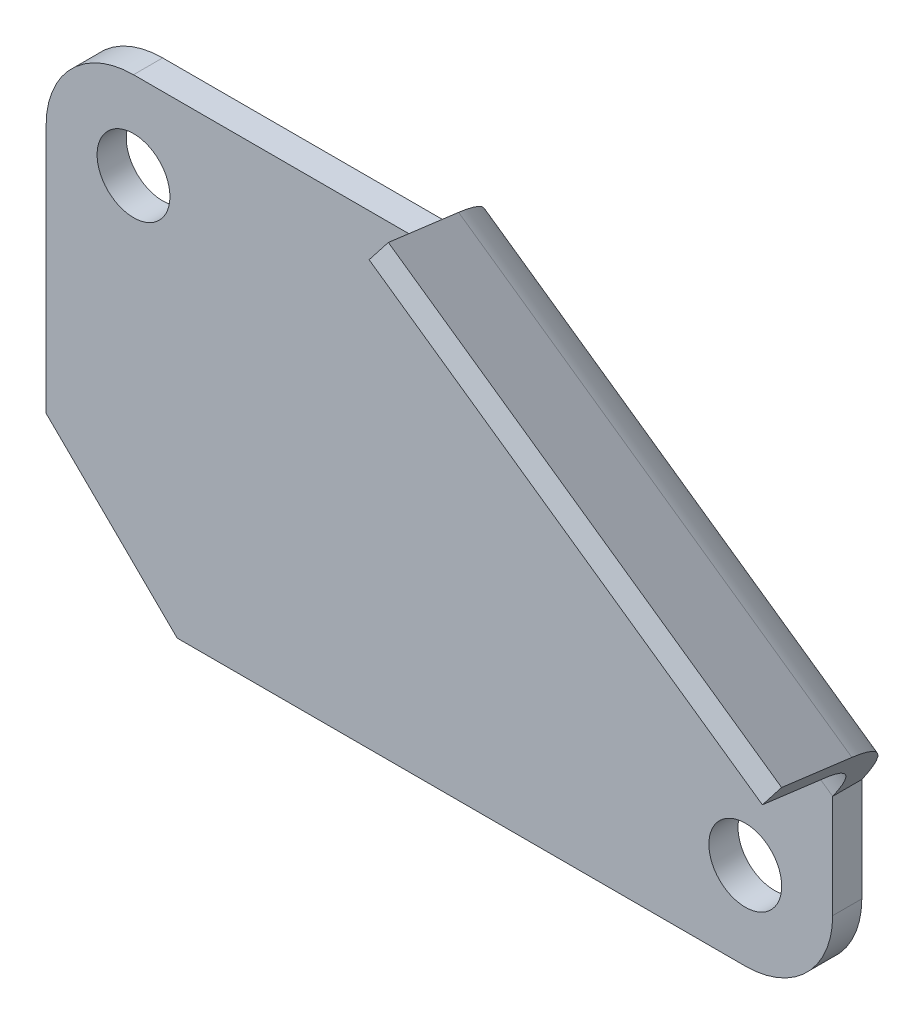
ISO-10303-21;
HEADER;
FILE_DESCRIPTION(('STEP AP214'),'2;1');
FILE_NAME('part.step','',(''),(''),'','','');
FILE_SCHEMA(('AUTOMOTIVE_DESIGN { 1 0 10303 214 1 1 1 1 }'));
ENDSEC;
DATA;
#1=APPLICATION_CONTEXT('core data for automotive mechanical design processes');
#2=APPLICATION_PROTOCOL_DEFINITION('international standard','automotive_design',2000,#1);
#3=PRODUCT_CONTEXT('',#1,'mechanical');
#4=PRODUCT('Part','Part','',(#3));
#5=PRODUCT_RELATED_PRODUCT_CATEGORY('part','',(#4));
#6=PRODUCT_DEFINITION_FORMATION('','',#4);
#7=PRODUCT_DEFINITION_CONTEXT('part definition',#1,'design');
#8=PRODUCT_DEFINITION('design','',#6,#7);
#9=PRODUCT_DEFINITION_SHAPE('','',#8);
#10=(LENGTH_UNIT() NAMED_UNIT(*) SI_UNIT(.MILLI.,.METRE.));
#11=(NAMED_UNIT(*) PLANE_ANGLE_UNIT() SI_UNIT($,.RADIAN.));
#12=(NAMED_UNIT(*) SI_UNIT($,.STERADIAN.) SOLID_ANGLE_UNIT());
#13=UNCERTAINTY_MEASURE_WITH_UNIT(LENGTH_MEASURE(1.E-05),#10,'distance_accuracy_value','');
#14=(GEOMETRIC_REPRESENTATION_CONTEXT(3) GLOBAL_UNCERTAINTY_ASSIGNED_CONTEXT((#13)) GLOBAL_UNIT_ASSIGNED_CONTEXT((#10,
#11,#12)) REPRESENTATION_CONTEXT('',''));
#15=CARTESIAN_POINT('',(0.,0.,0.));
#16=DIRECTION('',(0.,0.,1.));
#17=DIRECTION('',(1.,0.,0.));
#18=AXIS2_PLACEMENT_3D('',#15,#16,#17);
#19=CARTESIAN_POINT('',(95793.2786304845,11786.1362503613,4000.));
#20=DIRECTION('',(0.,0.,-1.));
#21=DIRECTION('',(-1.,0.,0.));
#22=AXIS2_PLACEMENT_3D('',#19,#20,#21);
#23=PLANE('',#22);
#24=CARTESIAN_POINT('',(95793.2786304845,11786.1362503613,4000.));
#25=DIRECTION('',(0.,0.,1.));
#26=DIRECTION('',(-1.,0.,0.));
#27=AXIS2_PLACEMENT_3D('',#24,#25,#26);
#28=CIRCLE('',#27,12000.);
#29=CARTESIAN_POINT('',(95793.2786304844,-213.863749638706,4000.));
#30=VERTEX_POINT('',#29);
#31=CARTESIAN_POINT('',(107793.278630484,11786.1362503614,4000.));
#32=VERTEX_POINT('',#31);
#33=EDGE_CURVE('E154',#30,#32,#28,.T.);
#34=ORIENTED_EDGE('',*,*,#33,.T.);
#35=DIRECTION('',(0.,1.,0.));
#36=VECTOR('',#35,1.);
#37=CARTESIAN_POINT('',(107793.278630484,25974.9291870368,4000.));
#38=LINE('',#37,#36);
#39=CARTESIAN_POINT('',(107793.278630484,25974.9291870368,4000.));
#40=VERTEX_POINT('',#39);
#41=EDGE_CURVE('E100',#32,#40,#38,.T.);
#42=ORIENTED_EDGE('',*,*,#41,.T.);
#43=DIRECTION('',(-0.819152044288991,0.573576436351048,0.));
#44=VECTOR('',#43,1.);
#45=CARTESIAN_POINT('',(53793.2786304845,63786.1362503613,4000.));
#46=LINE('',#45,#44);
#47=CARTESIAN_POINT('',(53793.2786304845,63786.1362503613,4000.));
#48=VERTEX_POINT('',#47);
#49=EDGE_CURVE('E181',#40,#48,#46,.T.);
#50=ORIENTED_EDGE('',*,*,#49,.T.);
#51=DIRECTION('',(-1.,0.,0.));
#52=VECTOR('',#51,1.);
#53=CARTESIAN_POINT('',(11793.2786304846,63786.1362503613,4000.));
#54=LINE('',#53,#52);
#55=CARTESIAN_POINT('',(11793.2786304846,63786.1362503613,4000.));
#56=VERTEX_POINT('',#55);
#57=EDGE_CURVE('E190',#48,#56,#54,.T.);
#58=ORIENTED_EDGE('',*,*,#57,.T.);
#59=CARTESIAN_POINT('',(11793.2786304845,51786.1362503613,4000.));
#60=DIRECTION('',(0.,0.,1.));
#61=DIRECTION('',(1.,0.,0.));
#62=AXIS2_PLACEMENT_3D('',#59,#60,#61);
#63=CIRCLE('',#62,12000.);
#64=CARTESIAN_POINT('',(-206.721369515522,51786.1362503612,4000.));
#65=VERTEX_POINT('',#64);
#66=EDGE_CURVE('E119',#56,#65,#63,.T.);
#67=ORIENTED_EDGE('',*,*,#66,.T.);
#68=DIRECTION('',(0.,-1.,0.));
#69=VECTOR('',#68,1.);
#70=CARTESIAN_POINT('',(-206.72136951552,17513.785772275,4000.));
#71=LINE('',#70,#69);
#72=CARTESIAN_POINT('',(-206.72136951552,17513.785772275,4000.));
#73=VERTEX_POINT('',#72);
#74=EDGE_CURVE('E111',#65,#73,#71,.T.);
#75=ORIENTED_EDGE('',*,*,#74,.T.);
#76=DIRECTION('',(0.712476328052723,-0.701696146465483,0.));
#77=VECTOR('',#76,1.);
#78=CARTESIAN_POINT('',(-206.72136951552,17513.785772275,4000.));
#79=LINE('',#78,#77);
#80=CARTESIAN_POINT('',(17793.2786304845,-213.863749638716,4000.));
#81=VERTEX_POINT('',#80);
#82=EDGE_CURVE('E120',#73,#81,#79,.T.);
#83=ORIENTED_EDGE('',*,*,#82,.T.);
#84=DIRECTION('',(1.,0.,0.));
#85=VECTOR('',#84,1.);
#86=CARTESIAN_POINT('',(95793.2786304844,-213.863749638706,4000.));
#87=LINE('',#86,#85);
#88=EDGE_CURVE('E57',#81,#30,#87,.T.);
#89=ORIENTED_EDGE('',*,*,#88,.T.);
#90=EDGE_LOOP('',(#34,#42,#50,#58,#67,#75,#83,#89));
#91=FACE_BOUND('',#90,.T.);
#92=CARTESIAN_POINT('',(11793.2786304845,51786.1362503613,4000.));
#93=DIRECTION('',(0.,0.,1.));
#94=DIRECTION('',(1.,0.,0.));
#95=AXIS2_PLACEMENT_3D('',#92,#93,#94);
#96=CIRCLE('',#95,5000.);
#97=CARTESIAN_POINT('',(16793.2786304845,51786.1362503613,4000.));
#98=VERTEX_POINT('',#97);
#99=EDGE_CURVE('E141',#98,#98,#96,.T.);
#100=ORIENTED_EDGE('',*,*,#99,.F.);
#101=EDGE_LOOP('',(#100));
#102=FACE_BOUND('',#101,.T.);
#103=CARTESIAN_POINT('',(95793.2786304845,11786.1362503613,4000.));
#104=DIRECTION('',(0.,0.,1.));
#105=DIRECTION('',(1.,0.,0.));
#106=AXIS2_PLACEMENT_3D('',#103,#104,#105);
#107=CIRCLE('',#106,5000.);
#108=CARTESIAN_POINT('',(100793.278630484,11786.1362503613,4000.));
#109=VERTEX_POINT('',#108);
#110=EDGE_CURVE('E197',#109,#109,#107,.T.);
#111=ORIENTED_EDGE('',*,*,#110,.F.);
#112=EDGE_LOOP('',(#111));
#113=FACE_BOUND('',#112,.T.);
#114=ADVANCED_FACE('F39',(#91,#102,#113),#23,.F.);
#115=CARTESIAN_POINT('',(95793.2786304845,11786.1362503613,0.));
#116=DIRECTION('',(0.,0.,-1.));
#117=DIRECTION('',(-1.,0.,0.));
#118=AXIS2_PLACEMENT_3D('',#115,#116,#117);
#119=PLANE('',#118);
#120=CARTESIAN_POINT('',(11793.2786304845,51786.1362503613,0.));
#121=DIRECTION('',(0.,0.,1.));
#122=DIRECTION('',(1.,0.,0.));
#123=AXIS2_PLACEMENT_3D('',#120,#121,#122);
#124=CIRCLE('',#123,5000.);
#125=CARTESIAN_POINT('',(16793.2786304845,51786.1362503613,0.));
#126=VERTEX_POINT('',#125);
#127=EDGE_CURVE('E194',#126,#126,#124,.T.);
#128=ORIENTED_EDGE('',*,*,#127,.T.);
#129=EDGE_LOOP('',(#128));
#130=FACE_BOUND('',#129,.T.);
#131=CARTESIAN_POINT('',(95793.2786304845,11786.1362503613,0.));
#132=DIRECTION('',(0.,0.,1.));
#133=DIRECTION('',(-1.,0.,0.));
#134=AXIS2_PLACEMENT_3D('',#131,#132,#133);
#135=CIRCLE('',#134,12000.);
#136=CARTESIAN_POINT('',(95793.2786304844,-213.863749638706,0.));
#137=VERTEX_POINT('',#136);
#138=CARTESIAN_POINT('',(107793.278630484,11786.1362503614,0.));
#139=VERTEX_POINT('',#138);
#140=EDGE_CURVE('E140',#137,#139,#135,.T.);
#141=ORIENTED_EDGE('',*,*,#140,.F.);
#142=DIRECTION('',(1.,0.,0.));
#143=VECTOR('',#142,1.);
#144=CARTESIAN_POINT('',(95793.2786304844,-213.863749638706,0.));
#145=LINE('',#144,#143);
#146=CARTESIAN_POINT('',(17793.2786304845,-213.863749638716,0.));
#147=VERTEX_POINT('',#146);
#148=EDGE_CURVE('E87',#147,#137,#145,.T.);
#149=ORIENTED_EDGE('',*,*,#148,.F.);
#150=DIRECTION('',(0.712476328052723,-0.701696146465483,0.));
#151=VECTOR('',#150,1.);
#152=CARTESIAN_POINT('',(-206.72136951552,17513.785772275,0.));
#153=LINE('',#152,#151);
#154=CARTESIAN_POINT('',(-206.72136951552,17513.785772275,0.));
#155=VERTEX_POINT('',#154);
#156=EDGE_CURVE('E81',#155,#147,#153,.T.);
#157=ORIENTED_EDGE('',*,*,#156,.F.);
#158=DIRECTION('',(0.,-1.,0.));
#159=VECTOR('',#158,1.);
#160=CARTESIAN_POINT('',(-206.72136951552,17513.785772275,0.));
#161=LINE('',#160,#159);
#162=CARTESIAN_POINT('',(-206.721369515522,51786.1362503612,0.));
#163=VERTEX_POINT('',#162);
#164=EDGE_CURVE('E130',#163,#155,#161,.T.);
#165=ORIENTED_EDGE('',*,*,#164,.F.);
#166=CARTESIAN_POINT('',(11793.2786304845,51786.1362503613,0.));
#167=DIRECTION('',(0.,0.,1.));
#168=DIRECTION('',(1.,0.,0.));
#169=AXIS2_PLACEMENT_3D('',#166,#167,#168);
#170=CIRCLE('',#169,12000.);
#171=CARTESIAN_POINT('',(11793.2786304846,63786.1362503613,0.));
#172=VERTEX_POINT('',#171);
#173=EDGE_CURVE('E146',#172,#163,#170,.T.);
#174=ORIENTED_EDGE('',*,*,#173,.F.);
#175=DIRECTION('',(-1.,0.,0.));
#176=VECTOR('',#175,1.);
#177=CARTESIAN_POINT('',(11793.2786304846,63786.1362503613,0.));
#178=LINE('',#177,#176);
#179=CARTESIAN_POINT('',(53793.2786304845,63786.1362503613,0.));
#180=VERTEX_POINT('',#179);
#181=EDGE_CURVE('E150',#180,#172,#178,.T.);
#182=ORIENTED_EDGE('',*,*,#181,.F.);
#183=DIRECTION('',(-0.819152044288991,0.573576436351048,0.));
#184=VECTOR('',#183,1.);
#185=CARTESIAN_POINT('',(53793.2786304845,63786.1362503613,0.));
#186=LINE('',#185,#184);
#187=CARTESIAN_POINT('',(107793.278630485,25974.9291870368,0.));
#188=VERTEX_POINT('',#187);
#189=EDGE_CURVE('E143',#188,#180,#186,.T.);
#190=ORIENTED_EDGE('',*,*,#189,.F.);
#191=DIRECTION('',(0.,1.,0.));
#192=VECTOR('',#191,1.);
#193=CARTESIAN_POINT('',(107793.278630484,25974.9291870368,0.));
#194=LINE('',#193,#192);
#195=EDGE_CURVE('E139',#139,#188,#194,.T.);
#196=ORIENTED_EDGE('',*,*,#195,.F.);
#197=EDGE_LOOP('',(#141,#149,#157,#165,#174,#182,#190,#196));
#198=FACE_BOUND('',#197,.T.);
#199=CARTESIAN_POINT('',(95793.2786304845,11786.1362503613,0.));
#200=DIRECTION('',(0.,0.,1.));
#201=DIRECTION('',(1.,0.,0.));
#202=AXIS2_PLACEMENT_3D('',#199,#200,#201);
#203=CIRCLE('',#202,5000.);
#204=CARTESIAN_POINT('',(100793.278630484,11786.1362503613,0.));
#205=VERTEX_POINT('',#204);
#206=EDGE_CURVE('E199',#205,#205,#203,.T.);
#207=ORIENTED_EDGE('',*,*,#206,.T.);
#208=EDGE_LOOP('',(#207));
#209=FACE_BOUND('',#208,.T.);
#210=ADVANCED_FACE('F277',(#130,#198,#209),#119,.T.);
#211=CARTESIAN_POINT('',(95793.2786304845,11786.1362503613,4000.));
#212=DIRECTION('',(0.,0.,-1.));
#213=DIRECTION('',(-1.,0.,0.));
#214=AXIS2_PLACEMENT_3D('',#211,#212,#213);
#215=CYLINDRICAL_SURFACE('',#214,12000.);
#216=ORIENTED_EDGE('',*,*,#140,.T.);
#217=DIRECTION('',(0.,0.,-1.));
#218=VECTOR('',#217,1.);
#219=CARTESIAN_POINT('',(107793.278630484,11786.1362503614,4000.));
#220=LINE('',#219,#218);
#221=EDGE_CURVE('E11',#32,#139,#220,.T.);
#222=ORIENTED_EDGE('',*,*,#221,.F.);
#223=ORIENTED_EDGE('',*,*,#33,.F.);
#224=DIRECTION('',(0.,0.,-1.));
#225=VECTOR('',#224,1.);
#226=CARTESIAN_POINT('',(95793.2786304844,-213.863749638706,4000.));
#227=LINE('',#226,#225);
#228=EDGE_CURVE('E133',#30,#137,#227,.T.);
#229=ORIENTED_EDGE('',*,*,#228,.T.);
#230=EDGE_LOOP('',(#216,#222,#223,#229));
#231=FACE_BOUND('',#230,.T.);
#232=ADVANCED_FACE('F41',(#231),#215,.T.);
#233=CARTESIAN_POINT('',(107793.278630484,25974.9291870368,4000.));
#234=DIRECTION('',(-1.,0.,0.));
#235=DIRECTION('',(0.,0.,1.));
#236=AXIS2_PLACEMENT_3D('',#233,#234,#235);
#237=PLANE('',#236);
#238=ORIENTED_EDGE('',*,*,#195,.T.);
#239=DIRECTION('',(0.,0.,-1.));
#240=VECTOR('',#239,1.);
#241=CARTESIAN_POINT('',(107793.278630484,25974.9291870368,4000.));
#242=LINE('',#241,#240);
#243=EDGE_CURVE('E48',#40,#188,#242,.T.);
#244=ORIENTED_EDGE('',*,*,#243,.F.);
#245=ORIENTED_EDGE('',*,*,#41,.F.);
#246=ORIENTED_EDGE('',*,*,#221,.T.);
#247=EDGE_LOOP('',(#238,#244,#245,#246));
#248=FACE_BOUND('',#247,.T.);
#249=ADVANCED_FACE('F178',(#248),#237,.F.);
#250=CARTESIAN_POINT('',(11793.2786304846,63786.1362503613,4000.));
#251=DIRECTION('',(0.,-1.,0.));
#252=DIRECTION('',(0.,0.,-1.));
#253=AXIS2_PLACEMENT_3D('',#250,#251,#252);
#254=PLANE('',#253);
#255=ORIENTED_EDGE('',*,*,#181,.T.);
#256=DIRECTION('',(0.,0.,-1.));
#257=VECTOR('',#256,1.);
#258=CARTESIAN_POINT('',(11793.2786304846,63786.1362503613,4000.));
#259=LINE('',#258,#257);
#260=EDGE_CURVE('E156',#56,#172,#259,.T.);
#261=ORIENTED_EDGE('',*,*,#260,.F.);
#262=ORIENTED_EDGE('',*,*,#57,.F.);
#263=DIRECTION('',(0.,0.,-1.));
#264=VECTOR('',#263,1.);
#265=CARTESIAN_POINT('',(53793.2786304845,63786.1362503613,4000.));
#266=LINE('',#265,#264);
#267=EDGE_CURVE('E162',#48,#180,#266,.T.);
#268=ORIENTED_EDGE('',*,*,#267,.T.);
#269=EDGE_LOOP('',(#255,#261,#262,#268));
#270=FACE_BOUND('',#269,.T.);
#271=ADVANCED_FACE('F296',(#270),#254,.F.);
#272=CARTESIAN_POINT('',(11793.2786304845,51786.1362503613,4000.));
#273=DIRECTION('',(0.,0.,-1.));
#274=DIRECTION('',(-1.,0.,0.));
#275=AXIS2_PLACEMENT_3D('',#272,#273,#274);
#276=CYLINDRICAL_SURFACE('',#275,12000.);
#277=ORIENTED_EDGE('',*,*,#173,.T.);
#278=DIRECTION('',(0.,0.,-1.));
#279=VECTOR('',#278,1.);
#280=CARTESIAN_POINT('',(-206.721369515522,51786.1362503612,4000.));
#281=LINE('',#280,#279);
#282=EDGE_CURVE('E126',#65,#163,#281,.T.);
#283=ORIENTED_EDGE('',*,*,#282,.F.);
#284=ORIENTED_EDGE('',*,*,#66,.F.);
#285=ORIENTED_EDGE('',*,*,#260,.T.);
#286=EDGE_LOOP('',(#277,#283,#284,#285));
#287=FACE_BOUND('',#286,.T.);
#288=ADVANCED_FACE('F300',(#287),#276,.T.);
#289=CARTESIAN_POINT('',(-206.72136951552,17513.785772275,4000.));
#290=DIRECTION('',(1.,0.,0.));
#291=DIRECTION('',(0.,0.,-1.));
#292=AXIS2_PLACEMENT_3D('',#289,#290,#291);
#293=PLANE('',#292);
#294=ORIENTED_EDGE('',*,*,#164,.T.);
#295=DIRECTION('',(0.,0.,-1.));
#296=VECTOR('',#295,1.);
#297=CARTESIAN_POINT('',(-206.72136951552,17513.785772275,4000.));
#298=LINE('',#297,#296);
#299=EDGE_CURVE('E125',#73,#155,#298,.T.);
#300=ORIENTED_EDGE('',*,*,#299,.F.);
#301=ORIENTED_EDGE('',*,*,#74,.F.);
#302=ORIENTED_EDGE('',*,*,#282,.T.);
#303=EDGE_LOOP('',(#294,#300,#301,#302));
#304=FACE_BOUND('',#303,.T.);
#305=ADVANCED_FACE('F124',(#304),#293,.F.);
#306=CARTESIAN_POINT('',(-206.72136951552,17513.785772275,4000.));
#307=DIRECTION('',(0.701696146465483,0.712476328052723,0.));
#308=DIRECTION('',(-0.712476328052723,0.701696146465483,0.));
#309=AXIS2_PLACEMENT_3D('',#306,#307,#308);
#310=PLANE('',#309);
#311=ORIENTED_EDGE('',*,*,#156,.T.);
#312=DIRECTION('',(0.,0.,-1.));
#313=VECTOR('',#312,1.);
#314=CARTESIAN_POINT('',(17793.2786304845,-213.863749638716,4000.));
#315=LINE('',#314,#313);
#316=EDGE_CURVE('E129',#81,#147,#315,.T.);
#317=ORIENTED_EDGE('',*,*,#316,.F.);
#318=ORIENTED_EDGE('',*,*,#82,.F.);
#319=ORIENTED_EDGE('',*,*,#299,.T.);
#320=EDGE_LOOP('',(#311,#317,#318,#319));
#321=FACE_BOUND('',#320,.T.);
#322=ADVANCED_FACE('F131',(#321),#310,.F.);
#323=CARTESIAN_POINT('',(95793.2786304844,-213.863749638706,4000.));
#324=DIRECTION('',(0.,1.,0.));
#325=DIRECTION('',(-1.,0.,0.));
#326=AXIS2_PLACEMENT_3D('',#323,#324,#325);
#327=PLANE('',#326);
#328=ORIENTED_EDGE('',*,*,#148,.T.);
#329=ORIENTED_EDGE('',*,*,#228,.F.);
#330=ORIENTED_EDGE('',*,*,#88,.F.);
#331=ORIENTED_EDGE('',*,*,#316,.T.);
#332=EDGE_LOOP('',(#328,#329,#330,#331));
#333=FACE_BOUND('',#332,.T.);
#334=ADVANCED_FACE('F286',(#333),#327,.F.);
#335=CARTESIAN_POINT('',(11793.2786304845,51786.1362503613,4000.));
#336=DIRECTION('',(0.,0.,-1.));
#337=DIRECTION('',(-1.,0.,0.));
#338=AXIS2_PLACEMENT_3D('',#335,#336,#337);
#339=CYLINDRICAL_SURFACE('',#338,5000.);
#340=ORIENTED_EDGE('',*,*,#99,.T.);
#341=EDGE_LOOP('',(#340));
#342=FACE_BOUND('',#341,.T.);
#343=ORIENTED_EDGE('',*,*,#127,.F.);
#344=EDGE_LOOP('',(#343));
#345=FACE_BOUND('',#344,.T.);
#346=ADVANCED_FACE('F290',(#342,#345),#339,.F.);
#347=CARTESIAN_POINT('',(95793.2786304845,11786.1362503613,4000.));
#348=DIRECTION('',(0.,0.,-1.));
#349=DIRECTION('',(-1.,0.,0.));
#350=AXIS2_PLACEMENT_3D('',#347,#348,#349);
#351=CYLINDRICAL_SURFACE('',#350,5000.);
#352=ORIENTED_EDGE('',*,*,#110,.T.);
#353=EDGE_LOOP('',(#352));
#354=FACE_BOUND('',#353,.T.);
#355=ORIENTED_EDGE('',*,*,#206,.F.);
#356=EDGE_LOOP('',(#355));
#357=FACE_BOUND('',#356,.T.);
#358=ADVANCED_FACE('F321',(#354,#357),#351,.F.);
#359=CARTESIAN_POINT('',(53793.2786304845,63786.1362503613,16000.));
#360=DIRECTION('',(0.819152044288991,-0.573576436351048,0.));
#361=DIRECTION('',(0.573576436351048,0.81915204428899,0.));
#362=AXIS2_PLACEMENT_3D('',#359,#360,#361);
#363=CYLINDRICAL_SURFACE('',#362,12000.);
#364=CARTESIAN_POINT('',(107793.278630485,25974.9291870368,16000.));
#365=DIRECTION('',(-0.819152044288991,0.573576436351048,0.));
#366=DIRECTION('',(0.573576436351048,0.819152044288991,0.));
#367=AXIS2_PLACEMENT_3D('',#364,#365,#366);
#368=CIRCLE('',#367,12000.);
#369=CARTESIAN_POINT('',(113940.684877489,34754.3351653302,10602.6462870593));
#370=VERTEX_POINT('',#369);
#371=EDGE_CURVE('E174',#370,#40,#368,.T.);
#372=ORIENTED_EDGE('',*,*,#371,.F.);
#373=DIRECTION('',(0.819152044288991,-0.573576436351048,0.));
#374=VECTOR('',#373,1.);
#375=CARTESIAN_POINT('',(59940.684877489,72565.5422286548,10602.6462870593));
#376=LINE('',#375,#374);
#377=CARTESIAN_POINT('',(59940.684877489,72565.5422286548,10602.6462870593));
#378=VERTEX_POINT('',#377);
#379=EDGE_CURVE('E205',#378,#370,#376,.T.);
#380=ORIENTED_EDGE('',*,*,#379,.F.);
#381=CARTESIAN_POINT('',(53793.2786304845,63786.1362503613,16000.));
#382=DIRECTION('',(-0.819152044288991,0.573576436351048,0.));
#383=DIRECTION('',(0.573576436351048,0.819152044288991,0.));
#384=AXIS2_PLACEMENT_3D('',#381,#382,#383);
#385=CIRCLE('',#384,12000.);
#386=EDGE_CURVE('E184',#378,#48,#385,.T.);
#387=ORIENTED_EDGE('',*,*,#386,.T.);
#388=ORIENTED_EDGE('',*,*,#49,.F.);
#389=EDGE_LOOP('',(#372,#380,#387,#388));
#390=FACE_BOUND('',#389,.T.);
#391=ADVANCED_FACE('F185',(#390),#363,.F.);
#392=CARTESIAN_POINT('',(59940.684877489,72565.5422286548,10602.6462870593));
#393=DIRECTION('',(-0.531810811144647,-0.759504549900131,0.37460659341591));
#394=DIRECTION('',(0.819152044288991,-0.573576436351048,0.));
#395=AXIS2_PLACEMENT_3D('',#392,#393,#394);
#396=PLANE('',#395);
#397=DIRECTION('',(-0.214865514885103,-0.306859756800777,-0.927183854566788));
#398=VECTOR('',#397,1.);
#399=CARTESIAN_POINT('',(113940.684877489,34754.3351653302,10602.6462870593));
#400=LINE('',#399,#398);
#401=CARTESIAN_POINT('',(116714.519162416,38715.7810703821,22572.246739713));
#402=VERTEX_POINT('',#401);
#403=EDGE_CURVE('E220',#402,#370,#400,.T.);
#404=ORIENTED_EDGE('',*,*,#403,.F.);
#405=DIRECTION('',(0.819152044288991,-0.573576436351048,0.));
#406=VECTOR('',#405,1.);
#407=CARTESIAN_POINT('',(62714.5191624163,76526.9881337066,22572.246739713));
#408=LINE('',#407,#406);
#409=CARTESIAN_POINT('',(62714.5191624163,76526.9881337066,22572.246739713));
#410=VERTEX_POINT('',#409);
#411=EDGE_CURVE('E212',#410,#402,#408,.T.);
#412=ORIENTED_EDGE('',*,*,#411,.F.);
#413=DIRECTION('',(-0.214865514885103,-0.306859756800777,-0.927183854566788));
#414=VECTOR('',#413,1.);
#415=CARTESIAN_POINT('',(59940.684877489,72565.5422286548,10602.6462870593));
#416=LINE('',#415,#414);
#417=EDGE_CURVE('E209',#410,#378,#416,.T.);
#418=ORIENTED_EDGE('',*,*,#417,.T.);
#419=ORIENTED_EDGE('',*,*,#379,.T.);
#420=EDGE_LOOP('',(#404,#412,#418,#419));
#421=FACE_BOUND('',#420,.T.);
#422=ADVANCED_FACE('F270',(#421),#396,.T.);
#423=CARTESIAN_POINT('',(62714.5191624163,76526.9881337066,22572.246739713));
#424=DIRECTION('',(0.165781490522149,0.236760505243943,0.957319675216637));
#425=DIRECTION('',(0.,-0.970752451937347,0.240082646306702));
#426=AXIS2_PLACEMENT_3D('',#423,#424,#425);
#427=PLANE('',#426);
#428=DIRECTION('',(-0.5490960077595,-0.784190368991781,0.28903120842413));
#429=VECTOR('',#428,1.);
#430=CARTESIAN_POINT('',(116714.519162416,38715.7810703821,22572.246739713));
#431=LINE('',#430,#429);
#432=CARTESIAN_POINT('',(118443.06533815,41184.4008458175,21662.3807364475));
#433=VERTEX_POINT('',#432);
#434=EDGE_CURVE('E219',#433,#402,#431,.T.);
#435=ORIENTED_EDGE('',*,*,#434,.F.);
#436=DIRECTION('',(0.819152044288991,-0.573576436351048,0.));
#437=VECTOR('',#436,1.);
#438=CARTESIAN_POINT('',(64443.0653381497,78995.607909142,21662.3807364475));
#439=LINE('',#438,#437);
#440=CARTESIAN_POINT('',(64443.0653381497,78995.607909142,21662.3807364475));
#441=VERTEX_POINT('',#440);
#442=EDGE_CURVE('E208',#441,#433,#439,.T.);
#443=ORIENTED_EDGE('',*,*,#442,.F.);
#444=DIRECTION('',(-0.5490960077595,-0.784190368991781,0.28903120842413));
#445=VECTOR('',#444,1.);
#446=CARTESIAN_POINT('',(62714.5191624163,76526.9881337066,22572.246739713));
#447=LINE('',#446,#445);
#448=EDGE_CURVE('E228',#441,#410,#447,.T.);
#449=ORIENTED_EDGE('',*,*,#448,.T.);
#450=ORIENTED_EDGE('',*,*,#411,.T.);
#451=EDGE_LOOP('',(#435,#443,#449,#450));
#452=FACE_BOUND('',#451,.T.);
#453=ADVANCED_FACE('F268',(#452),#427,.T.);
#454=CARTESIAN_POINT('',(61531.9677189317,74838.1296468242,9100.46398098297));
#455=DIRECTION('',(0.531810811144647,0.75950454990013,-0.374606593415911));
#456=DIRECTION('',(-0.81915204428899,0.573576436351048,0.));
#457=AXIS2_PLACEMENT_3D('',#454,#455,#456);
#458=PLANE('',#457);
#459=DIRECTION('',(0.214865514885105,0.306859756800777,0.927183854566788));
#460=VECTOR('',#459,1.);
#461=CARTESIAN_POINT('',(115531.967718932,37026.9225834997,9100.46398098297));
#462=LINE('',#461,#460);
#463=CARTESIAN_POINT('',(115531.967718932,37026.9225834997,9100.46398098296));
#464=VERTEX_POINT('',#463);
#465=EDGE_CURVE('E225',#464,#433,#462,.T.);
#466=ORIENTED_EDGE('',*,*,#465,.F.);
#467=DIRECTION('',(0.819152044288991,-0.573576436351048,0.));
#468=VECTOR('',#467,1.);
#469=CARTESIAN_POINT('',(61531.9677189318,74838.1296468242,9100.46398098296));
#470=LINE('',#469,#468);
#471=CARTESIAN_POINT('',(61531.9677189318,74838.1296468242,9100.46398098296));
#472=VERTEX_POINT('',#471);
#473=EDGE_CURVE('E203',#472,#464,#470,.T.);
#474=ORIENTED_EDGE('',*,*,#473,.F.);
#475=DIRECTION('',(0.214865514885105,0.306859756800777,0.927183854566788));
#476=VECTOR('',#475,1.);
#477=CARTESIAN_POINT('',(61531.9677189317,74838.1296468242,9100.46398098297));
#478=LINE('',#477,#476);
#479=EDGE_CURVE('E231',#472,#441,#478,.T.);
#480=ORIENTED_EDGE('',*,*,#479,.T.);
#481=ORIENTED_EDGE('',*,*,#442,.T.);
#482=EDGE_LOOP('',(#466,#474,#480,#481));
#483=FACE_BOUND('',#482,.T.);
#484=ADVANCED_FACE('F255',(#483),#458,.T.);
#485=CARTESIAN_POINT('',(53793.2786304845,63786.1362503613,14551.582867958));
#486=DIRECTION('',(0.819152044288991,-0.573576436351048,0.));
#487=DIRECTION('',(0.573576436351048,0.81915204428899,0.));
#488=AXIS2_PLACEMENT_3D('',#485,#486,#487);
#489=CYLINDRICAL_SURFACE('',#488,14551.582867958);
#490=CARTESIAN_POINT('',(107793.278630485,25974.9291870368,14551.582867958));
#491=DIRECTION('',(0.819152044288991,-0.573576436351048,0.));
#492=DIRECTION('',(0.573576436351048,0.819152044288991,0.));
#493=AXIS2_PLACEMENT_3D('',#490,#491,#492);
#494=CIRCLE('',#493,14551.582867958);
#495=EDGE_CURVE('E173',#188,#464,#494,.T.);
#496=ORIENTED_EDGE('',*,*,#495,.F.);
#497=ORIENTED_EDGE('',*,*,#189,.T.);
#498=CARTESIAN_POINT('',(53793.2786304845,63786.1362503613,14551.582867958));
#499=DIRECTION('',(0.819152044288991,-0.573576436351048,0.));
#500=DIRECTION('',(0.573576436351048,0.819152044288991,0.));
#501=AXIS2_PLACEMENT_3D('',#498,#499,#500);
#502=CIRCLE('',#501,14551.582867958);
#503=EDGE_CURVE('E233',#180,#472,#502,.T.);
#504=ORIENTED_EDGE('',*,*,#503,.T.);
#505=ORIENTED_EDGE('',*,*,#473,.T.);
#506=EDGE_LOOP('',(#496,#497,#504,#505));
#507=FACE_BOUND('',#506,.T.);
#508=ADVANCED_FACE('F238',(#507),#489,.T.);
#509=CARTESIAN_POINT('',(53793.2786304845,63786.1362503613,16000.));
#510=DIRECTION('',(0.819152044288991,-0.573576436351048,0.));
#511=DIRECTION('',(0.573576436351048,0.819152044288991,0.));
#512=AXIS2_PLACEMENT_3D('',#509,#510,#511);
#513=PLANE('',#512);
#514=ORIENTED_EDGE('',*,*,#386,.F.);
#515=ORIENTED_EDGE('',*,*,#417,.F.);
#516=ORIENTED_EDGE('',*,*,#448,.F.);
#517=ORIENTED_EDGE('',*,*,#479,.F.);
#518=ORIENTED_EDGE('',*,*,#503,.F.);
#519=ORIENTED_EDGE('',*,*,#267,.F.);
#520=EDGE_LOOP('',(#514,#515,#516,#517,#518,#519));
#521=FACE_BOUND('',#520,.T.);
#522=ADVANCED_FACE('F246',(#521),#513,.F.);
#523=CARTESIAN_POINT('',(107793.278630485,25974.9291870368,16000.));
#524=DIRECTION('',(0.819152044288991,-0.573576436351048,0.));
#525=DIRECTION('',(0.573576436351048,0.819152044288991,0.));
#526=AXIS2_PLACEMENT_3D('',#523,#524,#525);
#527=PLANE('',#526);
#528=ORIENTED_EDGE('',*,*,#371,.T.);
#529=ORIENTED_EDGE('',*,*,#243,.T.);
#530=ORIENTED_EDGE('',*,*,#495,.T.);
#531=ORIENTED_EDGE('',*,*,#465,.T.);
#532=ORIENTED_EDGE('',*,*,#434,.T.);
#533=ORIENTED_EDGE('',*,*,#403,.T.);
#534=EDGE_LOOP('',(#528,#529,#530,#531,#532,#533));
#535=FACE_BOUND('',#534,.T.);
#536=ADVANCED_FACE('F167',(#535),#527,.T.);
#537=CLOSED_SHELL('',(#114,#210,#232,#249,#271,#288,#305,#322,#334,#346,#358,#391,#422,#453,
#484,#508,#522,#536));
#538=MANIFOLD_SOLID_BREP('B2',#537);
#539=ADVANCED_BREP_SHAPE_REPRESENTATION('',(#18,#538),#14);
#540=SHAPE_DEFINITION_REPRESENTATION(#9,#539);
ENDSEC;
END-ISO-10303-21;
